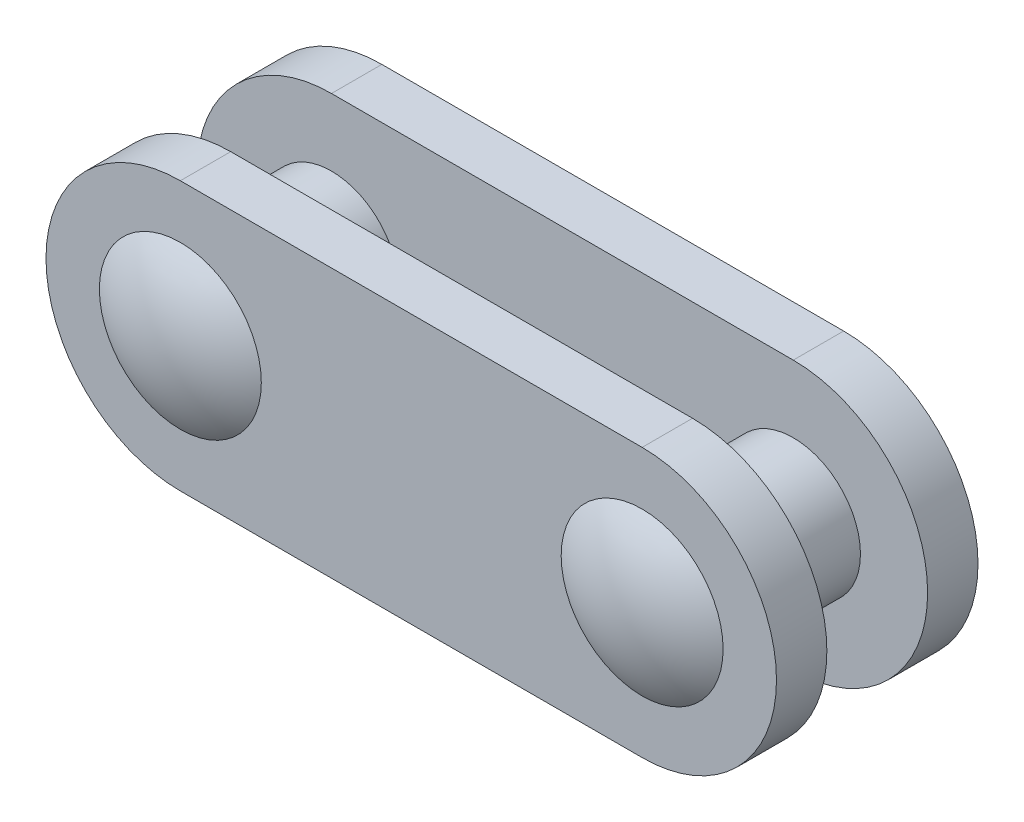
ISO-10303-21;
HEADER;
FILE_DESCRIPTION(('STEP AP214'),'2;1');
FILE_NAME('part.step','',(''),(''),'','','');
FILE_SCHEMA(('AUTOMOTIVE_DESIGN { 1 0 10303 214 1 1 1 1 }'));
ENDSEC;
DATA;
#1=APPLICATION_CONTEXT('core data for automotive mechanical design processes');
#2=APPLICATION_PROTOCOL_DEFINITION('international standard','automotive_design',2000,#1);
#3=PRODUCT_CONTEXT('',#1,'mechanical');
#4=PRODUCT('Part','Part','',(#3));
#5=PRODUCT_RELATED_PRODUCT_CATEGORY('part','',(#4));
#6=PRODUCT_DEFINITION_FORMATION('','',#4);
#7=PRODUCT_DEFINITION_CONTEXT('part definition',#1,'design');
#8=PRODUCT_DEFINITION('design','',#6,#7);
#9=PRODUCT_DEFINITION_SHAPE('','',#8);
#10=(LENGTH_UNIT() NAMED_UNIT(*) SI_UNIT(.MILLI.,.METRE.));
#11=(NAMED_UNIT(*) PLANE_ANGLE_UNIT() SI_UNIT($,.RADIAN.));
#12=(NAMED_UNIT(*) SI_UNIT($,.STERADIAN.) SOLID_ANGLE_UNIT());
#13=UNCERTAINTY_MEASURE_WITH_UNIT(LENGTH_MEASURE(1.E-05),#10,'distance_accuracy_value','');
#14=(GEOMETRIC_REPRESENTATION_CONTEXT(3) GLOBAL_UNCERTAINTY_ASSIGNED_CONTEXT((#13)) GLOBAL_UNIT_ASSIGNED_CONTEXT((#10,
#11,#12)) REPRESENTATION_CONTEXT('',''));
#15=CARTESIAN_POINT('',(0.,0.,0.));
#16=DIRECTION('',(0.,0.,1.));
#17=DIRECTION('',(1.,0.,0.));
#18=AXIS2_PLACEMENT_3D('',#15,#16,#17);
#19=CARTESIAN_POINT('',(0.,0.,6.));
#20=DIRECTION('',(0.,0.,-1.));
#21=DIRECTION('',(-1.,0.,0.));
#22=AXIS2_PLACEMENT_3D('',#19,#20,#21);
#23=CYLINDRICAL_SURFACE('',#22,8.);
#24=CARTESIAN_POINT('',(0.,0.,-3.));
#25=DIRECTION('',(0.,0.,1.));
#26=DIRECTION('',(1.,0.,0.));
#27=AXIS2_PLACEMENT_3D('',#24,#25,#26);
#28=CIRCLE('',#27,8.);
#29=CARTESIAN_POINT('',(0.,8.,-3.));
#30=VERTEX_POINT('',#29);
#31=CARTESIAN_POINT('',(0.,-8.,-3.));
#32=VERTEX_POINT('',#31);
#33=EDGE_CURVE('E169',#30,#32,#28,.T.);
#34=ORIENTED_EDGE('',*,*,#33,.F.);
#35=DIRECTION('',(0.,0.,-1.));
#36=VECTOR('',#35,1.);
#37=CARTESIAN_POINT('',(0.,8.,6.));
#38=LINE('',#37,#36);
#39=CARTESIAN_POINT('',(0.,8.,-6.));
#40=VERTEX_POINT('',#39);
#41=EDGE_CURVE('E132',#30,#40,#38,.T.);
#42=ORIENTED_EDGE('',*,*,#41,.T.);
#43=CARTESIAN_POINT('',(0.,0.,-6.));
#44=DIRECTION('',(0.,0.,1.));
#45=DIRECTION('',(1.,0.,0.));
#46=AXIS2_PLACEMENT_3D('',#43,#44,#45);
#47=CIRCLE('',#46,8.);
#48=CARTESIAN_POINT('',(0.,-8.,-6.));
#49=VERTEX_POINT('',#48);
#50=EDGE_CURVE('E149',#40,#49,#47,.T.);
#51=ORIENTED_EDGE('',*,*,#50,.T.);
#52=DIRECTION('',(0.,0.,-1.));
#53=VECTOR('',#52,1.);
#54=CARTESIAN_POINT('',(0.,-8.,6.));
#55=LINE('',#54,#53);
#56=EDGE_CURVE('E120',#32,#49,#55,.T.);
#57=ORIENTED_EDGE('',*,*,#56,.F.);
#58=EDGE_LOOP('',(#34,#42,#51,#57));
#59=FACE_BOUND('',#58,.T.);
#60=ADVANCED_FACE('F35',(#59),#23,.T.);
#61=CARTESIAN_POINT('',(0.,-8.,6.));
#62=DIRECTION('',(0.,1.,0.));
#63=DIRECTION('',(0.,0.,1.));
#64=AXIS2_PLACEMENT_3D('',#61,#62,#63);
#65=PLANE('',#64);
#66=DIRECTION('',(1.,0.,0.));
#67=VECTOR('',#66,1.);
#68=CARTESIAN_POINT('',(0.,-8.,-3.));
#69=LINE('',#68,#67);
#70=CARTESIAN_POINT('',(27.5,-8.,-3.));
#71=VERTEX_POINT('',#70);
#72=EDGE_CURVE('E167',#32,#71,#69,.T.);
#73=ORIENTED_EDGE('',*,*,#72,.F.);
#74=ORIENTED_EDGE('',*,*,#56,.T.);
#75=DIRECTION('',(1.,0.,0.));
#76=VECTOR('',#75,1.);
#77=CARTESIAN_POINT('',(0.,-8.,-6.));
#78=LINE('',#77,#76);
#79=CARTESIAN_POINT('',(27.5,-8.,-6.));
#80=VERTEX_POINT('',#79);
#81=EDGE_CURVE('E146',#49,#80,#78,.T.);
#82=ORIENTED_EDGE('',*,*,#81,.T.);
#83=DIRECTION('',(0.,0.,-1.));
#84=VECTOR('',#83,1.);
#85=CARTESIAN_POINT('',(27.5,-8.,6.));
#86=LINE('',#85,#84);
#87=EDGE_CURVE('E126',#71,#80,#86,.T.);
#88=ORIENTED_EDGE('',*,*,#87,.F.);
#89=EDGE_LOOP('',(#73,#74,#82,#88));
#90=FACE_BOUND('',#89,.T.);
#91=ADVANCED_FACE('F202',(#90),#65,.F.);
#92=CARTESIAN_POINT('',(27.5,0.,6.));
#93=DIRECTION('',(0.,0.,-1.));
#94=DIRECTION('',(-1.,0.,0.));
#95=AXIS2_PLACEMENT_3D('',#92,#93,#94);
#96=CYLINDRICAL_SURFACE('',#95,8.);
#97=CARTESIAN_POINT('',(27.5,0.,-3.));
#98=DIRECTION('',(0.,0.,1.));
#99=DIRECTION('',(1.,0.,0.));
#100=AXIS2_PLACEMENT_3D('',#97,#98,#99);
#101=CIRCLE('',#100,8.);
#102=CARTESIAN_POINT('',(27.5,8.,-3.));
#103=VERTEX_POINT('',#102);
#104=EDGE_CURVE('E58',#71,#103,#101,.T.);
#105=ORIENTED_EDGE('',*,*,#104,.F.);
#106=ORIENTED_EDGE('',*,*,#87,.T.);
#107=CARTESIAN_POINT('',(27.5,0.,-6.));
#108=DIRECTION('',(0.,0.,1.));
#109=DIRECTION('',(1.,0.,0.));
#110=AXIS2_PLACEMENT_3D('',#107,#108,#109);
#111=CIRCLE('',#110,8.);
#112=CARTESIAN_POINT('',(27.5,8.,-6.));
#113=VERTEX_POINT('',#112);
#114=EDGE_CURVE('E143',#80,#113,#111,.T.);
#115=ORIENTED_EDGE('',*,*,#114,.T.);
#116=DIRECTION('',(0.,0.,-1.));
#117=VECTOR('',#116,1.);
#118=CARTESIAN_POINT('',(27.5,8.,6.));
#119=LINE('',#118,#117);
#120=EDGE_CURVE('E130',#103,#113,#119,.T.);
#121=ORIENTED_EDGE('',*,*,#120,.F.);
#122=EDGE_LOOP('',(#105,#106,#115,#121));
#123=FACE_BOUND('',#122,.T.);
#124=ADVANCED_FACE('F207',(#123),#96,.T.);
#125=CARTESIAN_POINT('',(27.5,8.,6.));
#126=DIRECTION('',(0.,-1.,0.));
#127=DIRECTION('',(0.,0.,-1.));
#128=AXIS2_PLACEMENT_3D('',#125,#126,#127);
#129=PLANE('',#128);
#130=DIRECTION('',(-1.,0.,0.));
#131=VECTOR('',#130,1.);
#132=CARTESIAN_POINT('',(27.5,8.,-3.));
#133=LINE('',#132,#131);
#134=EDGE_CURVE('E164',#103,#30,#133,.T.);
#135=ORIENTED_EDGE('',*,*,#134,.F.);
#136=ORIENTED_EDGE('',*,*,#120,.T.);
#137=DIRECTION('',(-1.,0.,0.));
#138=VECTOR('',#137,1.);
#139=CARTESIAN_POINT('',(27.5,8.,-6.));
#140=LINE('',#139,#138);
#141=EDGE_CURVE('E140',#113,#40,#140,.T.);
#142=ORIENTED_EDGE('',*,*,#141,.T.);
#143=ORIENTED_EDGE('',*,*,#41,.F.);
#144=EDGE_LOOP('',(#135,#136,#142,#143));
#145=FACE_BOUND('',#144,.T.);
#146=ADVANCED_FACE('F226',(#145),#129,.F.);
#147=CARTESIAN_POINT('',(0.,4.5,-7.));
#148=DIRECTION('',(0.,0.,1.));
#149=DIRECTION('',(0.,-1.,0.));
#150=AXIS2_PLACEMENT_3D('',#147,#148,#149);
#151=PLANE('',#150);
#152=CARTESIAN_POINT('',(0.,0.,-7.));
#153=DIRECTION('',(0.,0.,1.));
#154=DIRECTION('',(0.,-1.,0.));
#155=AXIS2_PLACEMENT_3D('',#152,#153,#154);
#156=CIRCLE('',#155,4.5);
#157=CARTESIAN_POINT('',(0.,-4.5,-7.));
#158=VERTEX_POINT('',#157);
#159=EDGE_CURVE('E155',#158,#158,#156,.T.);
#160=ORIENTED_EDGE('',*,*,#159,.F.);
#161=EDGE_LOOP('',(#160));
#162=FACE_BOUND('',#161,.T.);
#163=ADVANCED_FACE('F242',(#162),#151,.F.);
#164=CARTESIAN_POINT('',(0.,0.,-7.));
#165=DIRECTION('',(0.,0.,1.));
#166=DIRECTION('',(0.,-1.,0.));
#167=AXIS2_PLACEMENT_3D('',#164,#165,#166);
#168=CYLINDRICAL_SURFACE('',#167,4.5);
#169=CARTESIAN_POINT('',(0.,0.,-6.));
#170=DIRECTION('',(0.,0.,1.));
#171=DIRECTION('',(1.,0.,0.));
#172=AXIS2_PLACEMENT_3D('',#169,#170,#171);
#173=CIRCLE('',#172,4.5);
#174=CARTESIAN_POINT('',(4.5,0.,-6.));
#175=VERTEX_POINT('',#174);
#176=EDGE_CURVE('E43',#175,#175,#173,.F.);
#177=ORIENTED_EDGE('',*,*,#176,.T.);
#178=EDGE_LOOP('',(#177));
#179=FACE_BOUND('',#178,.T.);
#180=ORIENTED_EDGE('',*,*,#159,.T.);
#181=EDGE_LOOP('',(#180));
#182=FACE_BOUND('',#181,.T.);
#183=ADVANCED_FACE('F235',(#179,#182),#168,.T.);
#184=CARTESIAN_POINT('',(0.,0.,-6.));
#185=DIRECTION('',(0.,0.,1.));
#186=DIRECTION('',(1.,0.,0.));
#187=AXIS2_PLACEMENT_3D('',#184,#185,#186);
#188=PLANE('',#187);
#189=CARTESIAN_POINT('',(27.5,0.,-6.));
#190=DIRECTION('',(0.,0.,1.));
#191=DIRECTION('',(1.,0.,0.));
#192=AXIS2_PLACEMENT_3D('',#189,#190,#191);
#193=CIRCLE('',#192,4.5);
#194=CARTESIAN_POINT('',(32.,0.,-6.));
#195=VERTEX_POINT('',#194);
#196=EDGE_CURVE('E11',#195,#195,#193,.F.);
#197=ORIENTED_EDGE('',*,*,#196,.F.);
#198=EDGE_LOOP('',(#197));
#199=FACE_BOUND('',#198,.T.);
#200=ORIENTED_EDGE('',*,*,#176,.F.);
#201=EDGE_LOOP('',(#200));
#202=FACE_BOUND('',#201,.T.);
#203=ORIENTED_EDGE('',*,*,#50,.F.);
#204=ORIENTED_EDGE('',*,*,#141,.F.);
#205=ORIENTED_EDGE('',*,*,#114,.F.);
#206=ORIENTED_EDGE('',*,*,#81,.F.);
#207=EDGE_LOOP('',(#203,#204,#205,#206));
#208=FACE_BOUND('',#207,.T.);
#209=ADVANCED_FACE('F231',(#199,#202,#208),#188,.F.);
#210=CARTESIAN_POINT('',(27.5,4.5,-7.));
#211=DIRECTION('',(0.,0.,1.));
#212=DIRECTION('',(0.,-1.,0.));
#213=AXIS2_PLACEMENT_3D('',#210,#211,#212);
#214=PLANE('',#213);
#215=CARTESIAN_POINT('',(27.5,0.,-7.));
#216=DIRECTION('',(0.,0.,1.));
#217=DIRECTION('',(0.,-1.,0.));
#218=AXIS2_PLACEMENT_3D('',#215,#216,#217);
#219=CIRCLE('',#218,4.5);
#220=CARTESIAN_POINT('',(27.5,-4.5,-7.));
#221=VERTEX_POINT('',#220);
#222=EDGE_CURVE('E161',#221,#221,#219,.T.);
#223=ORIENTED_EDGE('',*,*,#222,.F.);
#224=EDGE_LOOP('',(#223));
#225=FACE_BOUND('',#224,.T.);
#226=ADVANCED_FACE('F234',(#225),#214,.F.);
#227=CARTESIAN_POINT('',(27.5,0.,-7.));
#228=DIRECTION('',(0.,0.,1.));
#229=DIRECTION('',(0.,-1.,0.));
#230=AXIS2_PLACEMENT_3D('',#227,#228,#229);
#231=CYLINDRICAL_SURFACE('',#230,4.5);
#232=ORIENTED_EDGE('',*,*,#196,.T.);
#233=EDGE_LOOP('',(#232));
#234=FACE_BOUND('',#233,.T.);
#235=ORIENTED_EDGE('',*,*,#222,.T.);
#236=EDGE_LOOP('',(#235));
#237=FACE_BOUND('',#236,.T.);
#238=ADVANCED_FACE('F250',(#234,#237),#231,.T.);
#239=CARTESIAN_POINT('',(0.,0.,-3.));
#240=DIRECTION('',(0.,0.,1.));
#241=DIRECTION('',(1.,0.,0.));
#242=AXIS2_PLACEMENT_3D('',#239,#240,#241);
#243=PLANE('',#242);
#244=CARTESIAN_POINT('',(0.,0.,-3.));
#245=DIRECTION('',(0.,0.,1.));
#246=DIRECTION('',(1.,0.,0.));
#247=AXIS2_PLACEMENT_3D('',#244,#245,#246);
#248=CIRCLE('',#247,4.);
#249=CARTESIAN_POINT('',(4.,0.,-3.));
#250=VERTEX_POINT('',#249);
#251=EDGE_CURVE('E174',#250,#250,#248,.T.);
#252=ORIENTED_EDGE('',*,*,#251,.F.);
#253=EDGE_LOOP('',(#252));
#254=FACE_BOUND('',#253,.T.);
#255=CARTESIAN_POINT('',(27.5,0.,-3.));
#256=DIRECTION('',(0.,0.,1.));
#257=DIRECTION('',(1.,0.,0.));
#258=AXIS2_PLACEMENT_3D('',#255,#256,#257);
#259=CIRCLE('',#258,4.);
#260=CARTESIAN_POINT('',(31.5,0.,-3.));
#261=VERTEX_POINT('',#260);
#262=EDGE_CURVE('E171',#261,#261,#259,.T.);
#263=ORIENTED_EDGE('',*,*,#262,.F.);
#264=EDGE_LOOP('',(#263));
#265=FACE_BOUND('',#264,.T.);
#266=ORIENTED_EDGE('',*,*,#33,.T.);
#267=ORIENTED_EDGE('',*,*,#72,.T.);
#268=ORIENTED_EDGE('',*,*,#104,.T.);
#269=ORIENTED_EDGE('',*,*,#134,.T.);
#270=EDGE_LOOP('',(#266,#267,#268,#269));
#271=FACE_BOUND('',#270,.T.);
#272=ADVANCED_FACE('F198',(#254,#265,#271),#243,.T.);
#273=CARTESIAN_POINT('',(27.5,0.,-3.));
#274=DIRECTION('',(0.,0.,1.));
#275=DIRECTION('',(1.,0.,0.));
#276=AXIS2_PLACEMENT_3D('',#273,#274,#275);
#277=CYLINDRICAL_SURFACE('',#276,4.);
#278=ORIENTED_EDGE('',*,*,#262,.T.);
#279=EDGE_LOOP('',(#278));
#280=FACE_BOUND('',#279,.T.);
#281=CARTESIAN_POINT('',(27.5,0.,3.));
#282=DIRECTION('',(0.,0.,1.));
#283=DIRECTION('',(1.,0.,0.));
#284=AXIS2_PLACEMENT_3D('',#281,#282,#283);
#285=CIRCLE('',#284,4.);
#286=CARTESIAN_POINT('',(31.5,0.,3.));
#287=VERTEX_POINT('',#286);
#288=EDGE_CURVE('E115',#287,#287,#285,.T.);
#289=ORIENTED_EDGE('',*,*,#288,.F.);
#290=EDGE_LOOP('',(#289));
#291=FACE_BOUND('',#290,.T.);
#292=ADVANCED_FACE('F188',(#280,#291),#277,.T.);
#293=CARTESIAN_POINT('',(0.,0.,-3.));
#294=DIRECTION('',(0.,0.,1.));
#295=DIRECTION('',(1.,0.,0.));
#296=AXIS2_PLACEMENT_3D('',#293,#294,#295);
#297=CYLINDRICAL_SURFACE('',#296,4.);
#298=ORIENTED_EDGE('',*,*,#251,.T.);
#299=EDGE_LOOP('',(#298));
#300=FACE_BOUND('',#299,.T.);
#301=CARTESIAN_POINT('',(0.,0.,3.));
#302=DIRECTION('',(0.,0.,1.));
#303=DIRECTION('',(1.,0.,0.));
#304=AXIS2_PLACEMENT_3D('',#301,#302,#303);
#305=CIRCLE('',#304,4.);
#306=CARTESIAN_POINT('',(4.,0.,3.));
#307=VERTEX_POINT('',#306);
#308=EDGE_CURVE('E182',#307,#307,#305,.T.);
#309=ORIENTED_EDGE('',*,*,#308,.F.);
#310=EDGE_LOOP('',(#309));
#311=FACE_BOUND('',#310,.T.);
#312=ADVANCED_FACE('F186',(#300,#311),#297,.T.);
#313=CARTESIAN_POINT('',(0.,0.,3.));
#314=DIRECTION('',(0.,0.,1.));
#315=DIRECTION('',(1.,0.,0.));
#316=AXIS2_PLACEMENT_3D('',#313,#314,#315);
#317=PLANE('',#316);
#318=ORIENTED_EDGE('',*,*,#288,.T.);
#319=EDGE_LOOP('',(#318));
#320=FACE_BOUND('',#319,.T.);
#321=CARTESIAN_POINT('',(0.,0.,3.));
#322=DIRECTION('',(0.,0.,1.));
#323=DIRECTION('',(1.,0.,0.));
#324=AXIS2_PLACEMENT_3D('',#321,#322,#323);
#325=CIRCLE('',#324,8.);
#326=CARTESIAN_POINT('',(0.,8.,3.));
#327=VERTEX_POINT('',#326);
#328=CARTESIAN_POINT('',(0.,-8.,3.));
#329=VERTEX_POINT('',#328);
#330=EDGE_CURVE('E50',#327,#329,#325,.T.);
#331=ORIENTED_EDGE('',*,*,#330,.F.);
#332=DIRECTION('',(-1.,0.,0.));
#333=VECTOR('',#332,1.);
#334=CARTESIAN_POINT('',(27.5,8.,3.));
#335=LINE('',#334,#333);
#336=CARTESIAN_POINT('',(27.5,8.,3.));
#337=VERTEX_POINT('',#336);
#338=EDGE_CURVE('E177',#337,#327,#335,.T.);
#339=ORIENTED_EDGE('',*,*,#338,.F.);
#340=CARTESIAN_POINT('',(27.5,0.,3.));
#341=DIRECTION('',(0.,0.,1.));
#342=DIRECTION('',(1.,0.,0.));
#343=AXIS2_PLACEMENT_3D('',#340,#341,#342);
#344=CIRCLE('',#343,8.);
#345=CARTESIAN_POINT('',(27.5,-8.,3.));
#346=VERTEX_POINT('',#345);
#347=EDGE_CURVE('E102',#346,#337,#344,.T.);
#348=ORIENTED_EDGE('',*,*,#347,.F.);
#349=DIRECTION('',(1.,0.,0.));
#350=VECTOR('',#349,1.);
#351=CARTESIAN_POINT('',(0.,-8.,3.));
#352=LINE('',#351,#350);
#353=EDGE_CURVE('E98',#329,#346,#352,.T.);
#354=ORIENTED_EDGE('',*,*,#353,.F.);
#355=EDGE_LOOP('',(#331,#339,#348,#354));
#356=FACE_BOUND('',#355,.T.);
#357=ORIENTED_EDGE('',*,*,#308,.T.);
#358=EDGE_LOOP('',(#357));
#359=FACE_BOUND('',#358,.T.);
#360=ADVANCED_FACE('F99',(#320,#356,#359),#317,.F.);
#361=CARTESIAN_POINT('',(0.,0.,-1.00000000000004));
#362=DIRECTION('',(0.,0.,1.));
#363=DIRECTION('',(0.,1.,0.));
#364=AXIS2_PLACEMENT_3D('',#361,#362,#363);
#365=SPHERICAL_SURFACE('',#364,8.50000000000004);
#366=CARTESIAN_POINT('',(0.,0.,6.));
#367=DIRECTION('',(0.,0.,1.));
#368=DIRECTION('',(0.,-1.,0.));
#369=AXIS2_PLACEMENT_3D('',#366,#367,#368);
#370=CIRCLE('',#369,4.82182538049648);
#371=CARTESIAN_POINT('',(0.,-4.82182538049648,6.));
#372=VERTEX_POINT('',#371);
#373=EDGE_CURVE('E152',#372,#372,#370,.T.);
#374=ORIENTED_EDGE('',*,*,#373,.T.);
#375=EDGE_LOOP('',(#374));
#376=FACE_BOUND('',#375,.T.);
#377=ADVANCED_FACE('F195',(#376),#365,.T.);
#378=CARTESIAN_POINT('',(27.5,0.,-1.00000000000005));
#379=DIRECTION('',(0.,0.,1.));
#380=DIRECTION('',(0.,1.,0.));
#381=AXIS2_PLACEMENT_3D('',#378,#379,#380);
#382=SPHERICAL_SURFACE('',#381,8.50000000000004);
#383=CARTESIAN_POINT('',(27.5,0.,6.));
#384=DIRECTION('',(0.,0.,1.));
#385=DIRECTION('',(0.,-1.,0.));
#386=AXIS2_PLACEMENT_3D('',#383,#384,#385);
#387=CIRCLE('',#386,4.82182538049648);
#388=CARTESIAN_POINT('',(27.5,-4.82182538049648,6.));
#389=VERTEX_POINT('',#388);
#390=EDGE_CURVE('E158',#389,#389,#387,.T.);
#391=ORIENTED_EDGE('',*,*,#390,.T.);
#392=EDGE_LOOP('',(#391));
#393=FACE_BOUND('',#392,.T.);
#394=ADVANCED_FACE('F229',(#393),#382,.T.);
#395=CARTESIAN_POINT('',(0.,0.,6.));
#396=DIRECTION('',(0.,0.,1.));
#397=DIRECTION('',(1.,0.,0.));
#398=AXIS2_PLACEMENT_3D('',#395,#396,#397);
#399=PLANE('',#398);
#400=ORIENTED_EDGE('',*,*,#390,.F.);
#401=EDGE_LOOP('',(#400));
#402=FACE_BOUND('',#401,.T.);
#403=ORIENTED_EDGE('',*,*,#373,.F.);
#404=EDGE_LOOP('',(#403));
#405=FACE_BOUND('',#404,.T.);
#406=CARTESIAN_POINT('',(0.,0.,6.));
#407=DIRECTION('',(0.,0.,1.));
#408=DIRECTION('',(1.,0.,0.));
#409=AXIS2_PLACEMENT_3D('',#406,#407,#408);
#410=CIRCLE('',#409,8.);
#411=CARTESIAN_POINT('',(0.,8.,6.));
#412=VERTEX_POINT('',#411);
#413=CARTESIAN_POINT('',(0.,-8.,6.));
#414=VERTEX_POINT('',#413);
#415=EDGE_CURVE('E138',#412,#414,#410,.T.);
#416=ORIENTED_EDGE('',*,*,#415,.T.);
#417=DIRECTION('',(1.,0.,0.));
#418=VECTOR('',#417,1.);
#419=CARTESIAN_POINT('',(0.,-8.,6.));
#420=LINE('',#419,#418);
#421=CARTESIAN_POINT('',(27.5,-8.,6.));
#422=VERTEX_POINT('',#421);
#423=EDGE_CURVE('E118',#414,#422,#420,.T.);
#424=ORIENTED_EDGE('',*,*,#423,.T.);
#425=CARTESIAN_POINT('',(27.5,0.,6.));
#426=DIRECTION('',(0.,0.,1.));
#427=DIRECTION('',(1.,0.,0.));
#428=AXIS2_PLACEMENT_3D('',#425,#426,#427);
#429=CIRCLE('',#428,8.);
#430=CARTESIAN_POINT('',(27.5,8.,6.));
#431=VERTEX_POINT('',#430);
#432=EDGE_CURVE('E135',#422,#431,#429,.T.);
#433=ORIENTED_EDGE('',*,*,#432,.T.);
#434=DIRECTION('',(-1.,0.,0.));
#435=VECTOR('',#434,1.);
#436=CARTESIAN_POINT('',(27.5,8.,6.));
#437=LINE('',#436,#435);
#438=EDGE_CURVE('E133',#431,#412,#437,.T.);
#439=ORIENTED_EDGE('',*,*,#438,.T.);
#440=EDGE_LOOP('',(#416,#424,#433,#439));
#441=FACE_BOUND('',#440,.T.);
#442=ADVANCED_FACE('F224',(#402,#405,#441),#399,.T.);
#443=EDGE_CURVE('E127',#431,#337,#119,.T.);
#444=ORIENTED_EDGE('',*,*,#443,.T.);
#445=ORIENTED_EDGE('',*,*,#338,.T.);
#446=EDGE_CURVE('E114',#412,#327,#38,.T.);
#447=ORIENTED_EDGE('',*,*,#446,.F.);
#448=ORIENTED_EDGE('',*,*,#438,.F.);
#449=EDGE_LOOP('',(#444,#445,#447,#448));
#450=FACE_BOUND('',#449,.T.);
#451=ADVANCED_FACE('F218',(#450),#129,.F.);
#452=EDGE_CURVE('E123',#422,#346,#86,.T.);
#453=ORIENTED_EDGE('',*,*,#452,.T.);
#454=ORIENTED_EDGE('',*,*,#347,.T.);
#455=ORIENTED_EDGE('',*,*,#443,.F.);
#456=ORIENTED_EDGE('',*,*,#432,.F.);
#457=EDGE_LOOP('',(#453,#454,#455,#456));
#458=FACE_BOUND('',#457,.T.);
#459=ADVANCED_FACE('F214',(#458),#96,.T.);
#460=EDGE_CURVE('E112',#414,#329,#55,.T.);
#461=ORIENTED_EDGE('',*,*,#460,.T.);
#462=ORIENTED_EDGE('',*,*,#353,.T.);
#463=ORIENTED_EDGE('',*,*,#452,.F.);
#464=ORIENTED_EDGE('',*,*,#423,.F.);
#465=EDGE_LOOP('',(#461,#462,#463,#464));
#466=FACE_BOUND('',#465,.T.);
#467=ADVANCED_FACE('F117',(#466),#65,.F.);
#468=ORIENTED_EDGE('',*,*,#446,.T.);
#469=ORIENTED_EDGE('',*,*,#330,.T.);
#470=ORIENTED_EDGE('',*,*,#460,.F.);
#471=ORIENTED_EDGE('',*,*,#415,.F.);
#472=EDGE_LOOP('',(#468,#469,#470,#471));
#473=FACE_BOUND('',#472,.T.);
#474=ADVANCED_FACE('F37',(#473),#23,.T.);
#475=CLOSED_SHELL('',(#60,#91,#124,#146,#163,#183,#209,#226,#238,#272,#292,#312,#360,#377,#394,
#442,#451,#459,#467,#474));
#476=MANIFOLD_SOLID_BREP('B2',#475);
#477=ADVANCED_BREP_SHAPE_REPRESENTATION('',(#18,#476),#14);
#478=SHAPE_DEFINITION_REPRESENTATION(#9,#477);
ENDSEC;
END-ISO-10303-21;
